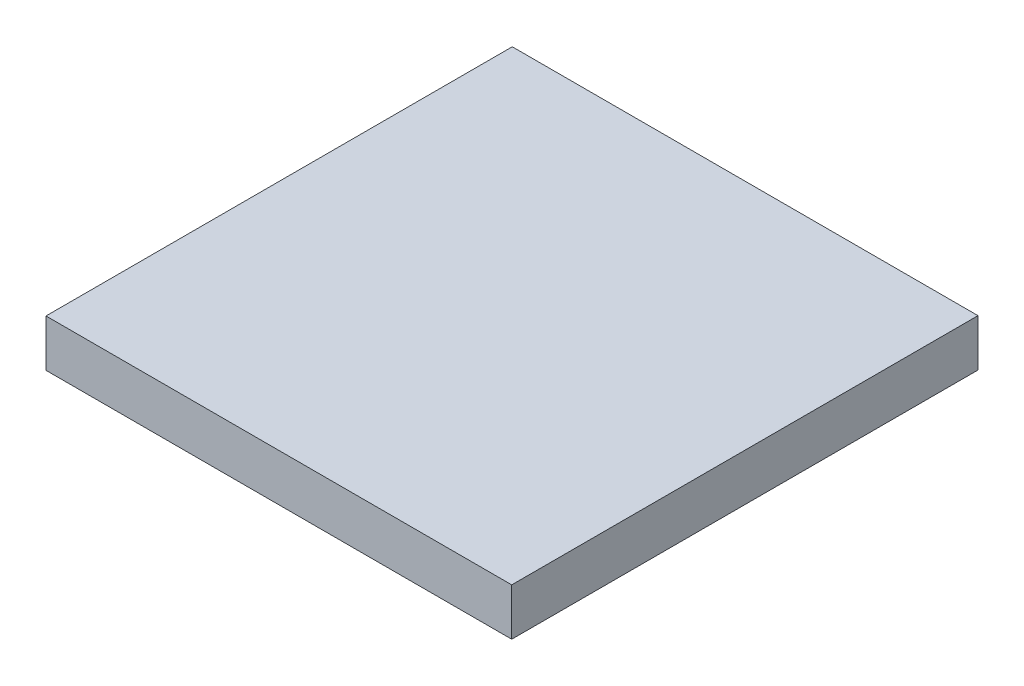
ISO-10303-21;
HEADER;
FILE_DESCRIPTION(('STEP AP214'),'2;1');
FILE_NAME('part.step','',(''),(''),'','','');
FILE_SCHEMA(('AUTOMOTIVE_DESIGN { 1 0 10303 214 1 1 1 1 }'));
ENDSEC;
DATA;
#1=APPLICATION_CONTEXT('core data for automotive mechanical design processes');
#2=APPLICATION_PROTOCOL_DEFINITION('international standard','automotive_design',2000,#1);
#3=PRODUCT_CONTEXT('',#1,'mechanical');
#4=PRODUCT('Part','Part','',(#3));
#5=PRODUCT_RELATED_PRODUCT_CATEGORY('part','',(#4));
#6=PRODUCT_DEFINITION_FORMATION('','',#4);
#7=PRODUCT_DEFINITION_CONTEXT('part definition',#1,'design');
#8=PRODUCT_DEFINITION('design','',#6,#7);
#9=PRODUCT_DEFINITION_SHAPE('','',#8);
#10=(LENGTH_UNIT() NAMED_UNIT(*) SI_UNIT(.MILLI.,.METRE.));
#11=(NAMED_UNIT(*) PLANE_ANGLE_UNIT() SI_UNIT($,.RADIAN.));
#12=(NAMED_UNIT(*) SI_UNIT($,.STERADIAN.) SOLID_ANGLE_UNIT());
#13=UNCERTAINTY_MEASURE_WITH_UNIT(LENGTH_MEASURE(1.E-05),#10,'distance_accuracy_value','');
#14=(GEOMETRIC_REPRESENTATION_CONTEXT(3) GLOBAL_UNCERTAINTY_ASSIGNED_CONTEXT((#13)) GLOBAL_UNIT_ASSIGNED_CONTEXT((#10,
#11,#12)) REPRESENTATION_CONTEXT('',''));
#15=CARTESIAN_POINT('',(0.,0.,0.));
#16=DIRECTION('',(0.,0.,1.));
#17=DIRECTION('',(1.,0.,0.));
#18=AXIS2_PLACEMENT_3D('',#15,#16,#17);
#19=CARTESIAN_POINT('',(10.3789028221712,1.95,10.3910618415057));
#20=DIRECTION('',(1.,0.,0.));
#21=DIRECTION('',(0.,0.,-1.));
#22=AXIS2_PLACEMENT_3D('',#19,#20,#21);
#23=PLANE('',#22);
#24=DIRECTION('',(0.,0.,1.));
#25=VECTOR('',#24,1.);
#26=CARTESIAN_POINT('',(10.3789028221712,1.05,10.3910618415057));
#27=LINE('',#26,#25);
#28=CARTESIAN_POINT('',(10.3789028221712,1.05,10.3910618415057));
#29=VERTEX_POINT('',#28);
#30=CARTESIAN_POINT('',(10.3789028221712,1.05,19.297686277082));
#31=VERTEX_POINT('',#30);
#32=EDGE_CURVE('E97',#29,#31,#27,.T.);
#33=ORIENTED_EDGE('',*,*,#32,.T.);
#34=DIRECTION('',(0.,-1.,0.));
#35=VECTOR('',#34,1.);
#36=CARTESIAN_POINT('',(10.3789028221712,1.95,19.297686277082));
#37=LINE('',#36,#35);
#38=CARTESIAN_POINT('',(10.3789028221712,1.95,19.297686277082));
#39=VERTEX_POINT('',#38);
#40=EDGE_CURVE('E11',#39,#31,#37,.T.);
#41=ORIENTED_EDGE('',*,*,#40,.F.);
#42=DIRECTION('',(0.,0.,1.));
#43=VECTOR('',#42,1.);
#44=CARTESIAN_POINT('',(10.3789028221712,1.95,10.3910618415057));
#45=LINE('',#44,#43);
#46=CARTESIAN_POINT('',(10.3789028221712,1.95,10.3910618415057));
#47=VERTEX_POINT('',#46);
#48=EDGE_CURVE('E85',#47,#39,#45,.T.);
#49=ORIENTED_EDGE('',*,*,#48,.F.);
#50=DIRECTION('',(0.,-1.,0.));
#51=VECTOR('',#50,1.);
#52=CARTESIAN_POINT('',(10.3789028221712,1.95,10.3910618415057));
#53=LINE('',#52,#51);
#54=EDGE_CURVE('E93',#47,#29,#53,.T.);
#55=ORIENTED_EDGE('',*,*,#54,.T.);
#56=EDGE_LOOP('',(#33,#41,#49,#55));
#57=FACE_BOUND('',#56,.T.);
#58=ADVANCED_FACE('F34',(#57),#23,.F.);
#59=CARTESIAN_POINT('',(10.3789028221712,1.95,19.297686277082));
#60=DIRECTION('',(0.,0.,-1.));
#61=DIRECTION('',(-1.,0.,0.));
#62=AXIS2_PLACEMENT_3D('',#59,#60,#61);
#63=PLANE('',#62);
#64=DIRECTION('',(1.,0.,0.));
#65=VECTOR('',#64,1.);
#66=CARTESIAN_POINT('',(10.3789028221712,1.05,19.297686277082));
#67=LINE('',#66,#65);
#68=CARTESIAN_POINT('',(19.2751052411751,1.05,19.297686277082));
#69=VERTEX_POINT('',#68);
#70=EDGE_CURVE('E89',#31,#69,#67,.T.);
#71=ORIENTED_EDGE('',*,*,#70,.T.);
#72=DIRECTION('',(0.,-1.,0.));
#73=VECTOR('',#72,1.);
#74=CARTESIAN_POINT('',(19.2751052411751,1.95,19.297686277082));
#75=LINE('',#74,#73);
#76=CARTESIAN_POINT('',(19.2751052411751,1.95,19.297686277082));
#77=VERTEX_POINT('',#76);
#78=EDGE_CURVE('E42',#77,#69,#75,.T.);
#79=ORIENTED_EDGE('',*,*,#78,.F.);
#80=DIRECTION('',(1.,0.,0.));
#81=VECTOR('',#80,1.);
#82=CARTESIAN_POINT('',(10.3789028221712,1.95,19.297686277082));
#83=LINE('',#82,#81);
#84=EDGE_CURVE('E80',#39,#77,#83,.T.);
#85=ORIENTED_EDGE('',*,*,#84,.F.);
#86=ORIENTED_EDGE('',*,*,#40,.T.);
#87=EDGE_LOOP('',(#71,#79,#85,#86));
#88=FACE_BOUND('',#87,.T.);
#89=ADVANCED_FACE('F88',(#88),#63,.F.);
#90=CARTESIAN_POINT('',(19.2751052411751,1.95,10.3910618415057));
#91=DIRECTION('',(-1.,0.,0.));
#92=DIRECTION('',(0.,0.,1.));
#93=AXIS2_PLACEMENT_3D('',#90,#91,#92);
#94=PLANE('',#93);
#95=DIRECTION('',(0.,0.,-1.));
#96=VECTOR('',#95,1.);
#97=CARTESIAN_POINT('',(19.2751052411751,1.05,10.3910618415057));
#98=LINE('',#97,#96);
#99=CARTESIAN_POINT('',(19.2751052411751,1.05,10.3910618415057));
#100=VERTEX_POINT('',#99);
#101=EDGE_CURVE('E67',#69,#100,#98,.T.);
#102=ORIENTED_EDGE('',*,*,#101,.T.);
#103=DIRECTION('',(0.,-1.,0.));
#104=VECTOR('',#103,1.);
#105=CARTESIAN_POINT('',(19.2751052411751,1.95,10.3910618415057));
#106=LINE('',#105,#104);
#107=CARTESIAN_POINT('',(19.2751052411751,1.95,10.3910618415057));
#108=VERTEX_POINT('',#107);
#109=EDGE_CURVE('E90',#108,#100,#106,.T.);
#110=ORIENTED_EDGE('',*,*,#109,.F.);
#111=DIRECTION('',(0.,0.,-1.));
#112=VECTOR('',#111,1.);
#113=CARTESIAN_POINT('',(19.2751052411751,1.95,10.3910618415057));
#114=LINE('',#113,#112);
#115=EDGE_CURVE('E83',#77,#108,#114,.T.);
#116=ORIENTED_EDGE('',*,*,#115,.F.);
#117=ORIENTED_EDGE('',*,*,#78,.T.);
#118=EDGE_LOOP('',(#102,#110,#116,#117));
#119=FACE_BOUND('',#118,.T.);
#120=ADVANCED_FACE('F91',(#119),#94,.F.);
#121=CARTESIAN_POINT('',(10.3789028221712,1.95,10.3910618415057));
#122=DIRECTION('',(0.,0.,1.));
#123=DIRECTION('',(1.,0.,0.));
#124=AXIS2_PLACEMENT_3D('',#121,#122,#123);
#125=PLANE('',#124);
#126=DIRECTION('',(-1.,0.,0.));
#127=VECTOR('',#126,1.);
#128=CARTESIAN_POINT('',(10.3789028221712,1.05,10.3910618415057));
#129=LINE('',#128,#127);
#130=EDGE_CURVE('E73',#100,#29,#129,.T.);
#131=ORIENTED_EDGE('',*,*,#130,.T.);
#132=ORIENTED_EDGE('',*,*,#54,.F.);
#133=DIRECTION('',(-1.,0.,0.));
#134=VECTOR('',#133,1.);
#135=CARTESIAN_POINT('',(10.3789028221712,1.95,10.3910618415057));
#136=LINE('',#135,#134);
#137=EDGE_CURVE('E50',#108,#47,#136,.T.);
#138=ORIENTED_EDGE('',*,*,#137,.F.);
#139=ORIENTED_EDGE('',*,*,#109,.T.);
#140=EDGE_LOOP('',(#131,#132,#138,#139));
#141=FACE_BOUND('',#140,.T.);
#142=ADVANCED_FACE('F104',(#141),#125,.F.);
#143=CARTESIAN_POINT('',(10.3789028221712,1.95,10.3910618415057));
#144=DIRECTION('',(0.,1.,0.));
#145=DIRECTION('',(0.,0.,1.));
#146=AXIS2_PLACEMENT_3D('',#143,#144,#145);
#147=PLANE('',#146);
#148=ORIENTED_EDGE('',*,*,#48,.T.);
#149=ORIENTED_EDGE('',*,*,#84,.T.);
#150=ORIENTED_EDGE('',*,*,#115,.T.);
#151=ORIENTED_EDGE('',*,*,#137,.T.);
#152=EDGE_LOOP('',(#148,#149,#150,#151));
#153=FACE_BOUND('',#152,.T.);
#154=ADVANCED_FACE('F81',(#153),#147,.T.);
#155=CARTESIAN_POINT('',(10.3789028221712,1.05,10.3910618415057));
#156=DIRECTION('',(0.,1.,0.));
#157=DIRECTION('',(0.,0.,1.));
#158=AXIS2_PLACEMENT_3D('',#155,#156,#157);
#159=PLANE('',#158);
#160=ORIENTED_EDGE('',*,*,#32,.F.);
#161=ORIENTED_EDGE('',*,*,#130,.F.);
#162=ORIENTED_EDGE('',*,*,#101,.F.);
#163=ORIENTED_EDGE('',*,*,#70,.F.);
#164=EDGE_LOOP('',(#160,#161,#162,#163));
#165=FACE_BOUND('',#164,.T.);
#166=ADVANCED_FACE('F107',(#165),#159,.F.);
#167=CLOSED_SHELL('',(#58,#89,#120,#142,#154,#166));
#168=MANIFOLD_SOLID_BREP('B2',#167);
#169=ADVANCED_BREP_SHAPE_REPRESENTATION('',(#18,#168),#14);
#170=SHAPE_DEFINITION_REPRESENTATION(#9,#169);
ENDSEC;
END-ISO-10303-21;
